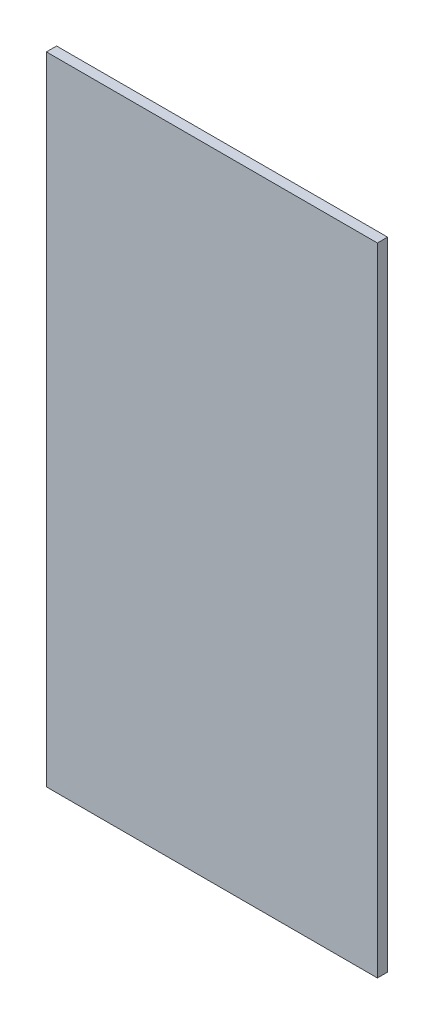
ISO-10303-21;
HEADER;
FILE_DESCRIPTION(('STEP AP214'),'2;1');
FILE_NAME('part.step','',(''),(''),'','','');
FILE_SCHEMA(('AUTOMOTIVE_DESIGN { 1 0 10303 214 1 1 1 1 }'));
ENDSEC;
DATA;
#1=APPLICATION_CONTEXT('core data for automotive mechanical design processes');
#2=APPLICATION_PROTOCOL_DEFINITION('international standard','automotive_design',2000,#1);
#3=PRODUCT_CONTEXT('',#1,'mechanical');
#4=PRODUCT('Part','Part','',(#3));
#5=PRODUCT_RELATED_PRODUCT_CATEGORY('part','',(#4));
#6=PRODUCT_DEFINITION_FORMATION('','',#4);
#7=PRODUCT_DEFINITION_CONTEXT('part definition',#1,'design');
#8=PRODUCT_DEFINITION('design','',#6,#7);
#9=PRODUCT_DEFINITION_SHAPE('','',#8);
#10=(LENGTH_UNIT() NAMED_UNIT(*) SI_UNIT(.MILLI.,.METRE.));
#11=(NAMED_UNIT(*) PLANE_ANGLE_UNIT() SI_UNIT($,.RADIAN.));
#12=(NAMED_UNIT(*) SI_UNIT($,.STERADIAN.) SOLID_ANGLE_UNIT());
#13=UNCERTAINTY_MEASURE_WITH_UNIT(LENGTH_MEASURE(1.E-05),#10,'distance_accuracy_value','');
#14=(GEOMETRIC_REPRESENTATION_CONTEXT(3) GLOBAL_UNCERTAINTY_ASSIGNED_CONTEXT((#13)) GLOBAL_UNIT_ASSIGNED_CONTEXT((#10,
#11,#12)) REPRESENTATION_CONTEXT('',''));
#15=CARTESIAN_POINT('',(0.,0.,0.));
#16=DIRECTION('',(0.,0.,1.));
#17=DIRECTION('',(1.,0.,0.));
#18=AXIS2_PLACEMENT_3D('',#15,#16,#17);
#19=CARTESIAN_POINT('',(0.,0.,1.6));
#20=DIRECTION('',(1.,0.,0.));
#21=DIRECTION('',(0.,0.,-1.));
#22=AXIS2_PLACEMENT_3D('',#19,#20,#21);
#23=PLANE('',#22);
#24=DIRECTION('',(0.,-1.,0.));
#25=VECTOR('',#24,1.);
#26=CARTESIAN_POINT('',(0.,0.,0.));
#27=LINE('',#26,#25);
#28=CARTESIAN_POINT('',(0.,100.,0.));
#29=VERTEX_POINT('',#28);
#30=CARTESIAN_POINT('',(0.,0.,0.));
#31=VERTEX_POINT('',#30);
#32=EDGE_CURVE('E99',#29,#31,#27,.T.);
#33=ORIENTED_EDGE('',*,*,#32,.T.);
#34=DIRECTION('',(0.,0.,-1.));
#35=VECTOR('',#34,1.);
#36=CARTESIAN_POINT('',(0.,0.,1.6));
#37=LINE('',#36,#35);
#38=CARTESIAN_POINT('',(0.,0.,1.6));
#39=VERTEX_POINT('',#38);
#40=EDGE_CURVE('E11',#39,#31,#37,.T.);
#41=ORIENTED_EDGE('',*,*,#40,.F.);
#42=DIRECTION('',(0.,-1.,0.));
#43=VECTOR('',#42,1.);
#44=CARTESIAN_POINT('',(0.,0.,1.6));
#45=LINE('',#44,#43);
#46=CARTESIAN_POINT('',(0.,100.,1.6));
#47=VERTEX_POINT('',#46);
#48=EDGE_CURVE('E87',#47,#39,#45,.T.);
#49=ORIENTED_EDGE('',*,*,#48,.F.);
#50=DIRECTION('',(0.,0.,-1.));
#51=VECTOR('',#50,1.);
#52=CARTESIAN_POINT('',(0.,100.,1.6));
#53=LINE('',#52,#51);
#54=EDGE_CURVE('E95',#47,#29,#53,.T.);
#55=ORIENTED_EDGE('',*,*,#54,.T.);
#56=EDGE_LOOP('',(#33,#41,#49,#55));
#57=FACE_BOUND('',#56,.T.);
#58=ADVANCED_FACE('F36',(#57),#23,.F.);
#59=CARTESIAN_POINT('',(0.,0.,1.6));
#60=DIRECTION('',(0.,1.,0.));
#61=DIRECTION('',(0.,0.,1.));
#62=AXIS2_PLACEMENT_3D('',#59,#60,#61);
#63=PLANE('',#62);
#64=DIRECTION('',(1.,0.,0.));
#65=VECTOR('',#64,1.);
#66=CARTESIAN_POINT('',(0.,0.,0.));
#67=LINE('',#66,#65);
#68=CARTESIAN_POINT('',(52.,0.,0.));
#69=VERTEX_POINT('',#68);
#70=EDGE_CURVE('E91',#31,#69,#67,.T.);
#71=ORIENTED_EDGE('',*,*,#70,.T.);
#72=DIRECTION('',(0.,0.,-1.));
#73=VECTOR('',#72,1.);
#74=CARTESIAN_POINT('',(52.,0.,1.6));
#75=LINE('',#74,#73);
#76=CARTESIAN_POINT('',(52.,0.,1.6));
#77=VERTEX_POINT('',#76);
#78=EDGE_CURVE('E44',#77,#69,#75,.T.);
#79=ORIENTED_EDGE('',*,*,#78,.F.);
#80=DIRECTION('',(1.,0.,0.));
#81=VECTOR('',#80,1.);
#82=CARTESIAN_POINT('',(0.,0.,1.6));
#83=LINE('',#82,#81);
#84=EDGE_CURVE('E82',#39,#77,#83,.T.);
#85=ORIENTED_EDGE('',*,*,#84,.F.);
#86=ORIENTED_EDGE('',*,*,#40,.T.);
#87=EDGE_LOOP('',(#71,#79,#85,#86));
#88=FACE_BOUND('',#87,.T.);
#89=ADVANCED_FACE('F90',(#88),#63,.F.);
#90=CARTESIAN_POINT('',(52.,0.,1.6));
#91=DIRECTION('',(-1.,0.,0.));
#92=DIRECTION('',(0.,-1.,0.));
#93=AXIS2_PLACEMENT_3D('',#90,#91,#92);
#94=PLANE('',#93);
#95=DIRECTION('',(0.,1.,0.));
#96=VECTOR('',#95,1.);
#97=CARTESIAN_POINT('',(52.,0.,0.));
#98=LINE('',#97,#96);
#99=CARTESIAN_POINT('',(52.,100.,0.));
#100=VERTEX_POINT('',#99);
#101=EDGE_CURVE('E69',#69,#100,#98,.T.);
#102=ORIENTED_EDGE('',*,*,#101,.T.);
#103=DIRECTION('',(0.,0.,-1.));
#104=VECTOR('',#103,1.);
#105=CARTESIAN_POINT('',(52.,100.,1.6));
#106=LINE('',#105,#104);
#107=CARTESIAN_POINT('',(52.,100.,1.6));
#108=VERTEX_POINT('',#107);
#109=EDGE_CURVE('E92',#108,#100,#106,.T.);
#110=ORIENTED_EDGE('',*,*,#109,.F.);
#111=DIRECTION('',(0.,1.,0.));
#112=VECTOR('',#111,1.);
#113=CARTESIAN_POINT('',(52.,0.,1.6));
#114=LINE('',#113,#112);
#115=EDGE_CURVE('E85',#77,#108,#114,.T.);
#116=ORIENTED_EDGE('',*,*,#115,.F.);
#117=ORIENTED_EDGE('',*,*,#78,.T.);
#118=EDGE_LOOP('',(#102,#110,#116,#117));
#119=FACE_BOUND('',#118,.T.);
#120=ADVANCED_FACE('F93',(#119),#94,.F.);
#121=CARTESIAN_POINT('',(0.,100.,1.6));
#122=DIRECTION('',(0.,-1.,0.));
#123=DIRECTION('',(1.,0.,0.));
#124=AXIS2_PLACEMENT_3D('',#121,#122,#123);
#125=PLANE('',#124);
#126=DIRECTION('',(-1.,0.,0.));
#127=VECTOR('',#126,1.);
#128=CARTESIAN_POINT('',(0.,100.,0.));
#129=LINE('',#128,#127);
#130=EDGE_CURVE('E75',#100,#29,#129,.T.);
#131=ORIENTED_EDGE('',*,*,#130,.T.);
#132=ORIENTED_EDGE('',*,*,#54,.F.);
#133=DIRECTION('',(-1.,0.,0.));
#134=VECTOR('',#133,1.);
#135=CARTESIAN_POINT('',(0.,100.,1.6));
#136=LINE('',#135,#134);
#137=EDGE_CURVE('E52',#108,#47,#136,.T.);
#138=ORIENTED_EDGE('',*,*,#137,.F.);
#139=ORIENTED_EDGE('',*,*,#109,.T.);
#140=EDGE_LOOP('',(#131,#132,#138,#139));
#141=FACE_BOUND('',#140,.T.);
#142=ADVANCED_FACE('F106',(#141),#125,.F.);
#143=CARTESIAN_POINT('',(0.,0.,1.6));
#144=DIRECTION('',(0.,0.,-1.));
#145=DIRECTION('',(-1.,0.,0.));
#146=AXIS2_PLACEMENT_3D('',#143,#144,#145);
#147=PLANE('',#146);
#148=ORIENTED_EDGE('',*,*,#48,.T.);
#149=ORIENTED_EDGE('',*,*,#84,.T.);
#150=ORIENTED_EDGE('',*,*,#115,.T.);
#151=ORIENTED_EDGE('',*,*,#137,.T.);
#152=EDGE_LOOP('',(#148,#149,#150,#151));
#153=FACE_BOUND('',#152,.T.);
#154=ADVANCED_FACE('F83',(#153),#147,.F.);
#155=CARTESIAN_POINT('',(0.,0.,0.));
#156=DIRECTION('',(0.,0.,-1.));
#157=DIRECTION('',(-1.,0.,0.));
#158=AXIS2_PLACEMENT_3D('',#155,#156,#157);
#159=PLANE('',#158);
#160=ORIENTED_EDGE('',*,*,#32,.F.);
#161=ORIENTED_EDGE('',*,*,#130,.F.);
#162=ORIENTED_EDGE('',*,*,#101,.F.);
#163=ORIENTED_EDGE('',*,*,#70,.F.);
#164=EDGE_LOOP('',(#160,#161,#162,#163));
#165=FACE_BOUND('',#164,.T.);
#166=ADVANCED_FACE('F109',(#165),#159,.T.);
#167=CLOSED_SHELL('',(#58,#89,#120,#142,#154,#166));
#168=MANIFOLD_SOLID_BREP('B2',#167);
#169=ADVANCED_BREP_SHAPE_REPRESENTATION('',(#18,#168),#14);
#170=SHAPE_DEFINITION_REPRESENTATION(#9,#169);
ENDSEC;
END-ISO-10303-21;
